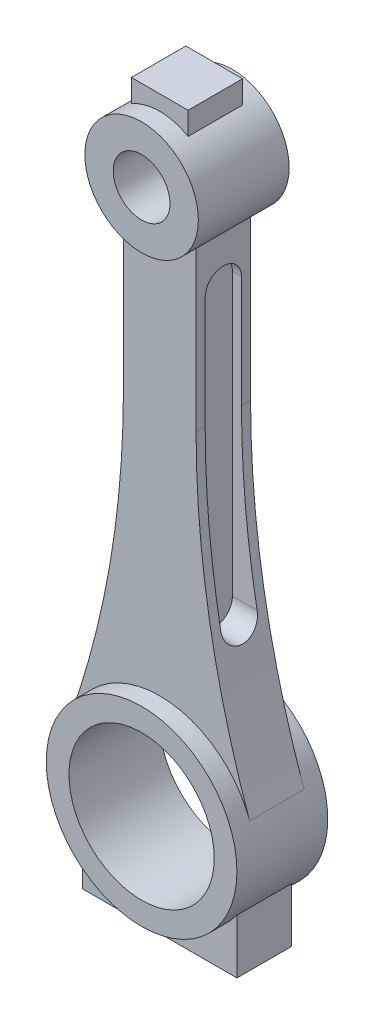
ISO-10303-21;
HEADER;
FILE_DESCRIPTION(('STEP AP214'),'2;1');
FILE_NAME('part.step','',(''),(''),'','','');
FILE_SCHEMA(('AUTOMOTIVE_DESIGN { 1 0 10303 214 1 1 1 1 }'));
ENDSEC;
DATA;
#1=APPLICATION_CONTEXT('core data for automotive mechanical design processes');
#2=APPLICATION_PROTOCOL_DEFINITION('international standard','automotive_design',2000,#1);
#3=PRODUCT_CONTEXT('',#1,'mechanical');
#4=PRODUCT('Part','Part','',(#3));
#5=PRODUCT_RELATED_PRODUCT_CATEGORY('part','',(#4));
#6=PRODUCT_DEFINITION_FORMATION('','',#4);
#7=PRODUCT_DEFINITION_CONTEXT('part definition',#1,'design');
#8=PRODUCT_DEFINITION('design','',#6,#7);
#9=PRODUCT_DEFINITION_SHAPE('','',#8);
#10=(LENGTH_UNIT() NAMED_UNIT(*) SI_UNIT(.MILLI.,.METRE.));
#11=(NAMED_UNIT(*) PLANE_ANGLE_UNIT() SI_UNIT($,.RADIAN.));
#12=(NAMED_UNIT(*) SI_UNIT($,.STERADIAN.) SOLID_ANGLE_UNIT());
#13=UNCERTAINTY_MEASURE_WITH_UNIT(LENGTH_MEASURE(1.E-05),#10,'distance_accuracy_value','');
#14=(GEOMETRIC_REPRESENTATION_CONTEXT(3) GLOBAL_UNCERTAINTY_ASSIGNED_CONTEXT((#13)) GLOBAL_UNIT_ASSIGNED_CONTEXT((#10,
#11,#12)) REPRESENTATION_CONTEXT('',''));
#15=CARTESIAN_POINT('',(0.,0.,0.));
#16=DIRECTION('',(0.,0.,1.));
#17=DIRECTION('',(1.,0.,0.));
#18=AXIS2_PLACEMENT_3D('',#15,#16,#17);
#19=CARTESIAN_POINT('',(212.132819979024,75.3953136438508,6.));
#20=DIRECTION('',(0.,0.,-1.));
#21=DIRECTION('',(-1.,0.,0.));
#22=AXIS2_PLACEMENT_3D('',#19,#20,#21);
#23=CYLINDRICAL_SURFACE('',#22,204.132819979024);
#24=CARTESIAN_POINT('',(11.4544735884215,38.,-4.00000000000001));
#25=CARTESIAN_POINT('',(11.4757515518411,37.8858086335559,-4.00000967356236));
#26=CARTESIAN_POINT('',(11.497127848932,37.7716411229782,-3.9951101211208));
#27=CARTESIAN_POINT('',(11.5399210356049,37.544152772884,-3.97557755361704));
#28=CARTESIAN_POINT('',(11.5613379239584,37.4308319082382,-3.9609448286138));
#29=CARTESIAN_POINT('',(11.6040518019029,37.2058589467753,-3.92203609087538));
#30=CARTESIAN_POINT('',(11.6253488219803,37.0942064124742,-3.89776265395078));
#31=CARTESIAN_POINT('',(11.6676599337569,36.8733657612217,-3.83975872762631));
#32=CARTESIAN_POINT('',(11.6886740293759,36.7641776101131,-3.80602836938937));
#33=CARTESIAN_POINT('',(11.7510730473326,36.4413470108117,-3.69089420326938));
#34=CARTESIAN_POINT('',(11.7918289081029,36.2323636826891,-3.59553432969808));
#35=CARTESIAN_POINT('',(11.8702126062764,35.833491871712,-3.37027556179514));
#36=CARTESIAN_POINT('',(11.9078413597511,35.643597793309,-3.24038682968163));
#37=CARTESIAN_POINT('',(11.9784728244352,35.2894796680367,-2.950436910244));
#38=CARTESIAN_POINT('',(12.0115036519544,35.1250988255321,-2.79057453802655));
#39=CARTESIAN_POINT('',(12.0720036427705,34.8256035029566,-2.44449926104124));
#40=CARTESIAN_POINT('',(12.0994724370193,34.6904909648341,-2.25828460915733));
#41=CARTESIAN_POINT('',(12.1473413477104,34.4559602912754,-1.86832249559897));
#42=CARTESIAN_POINT('',(12.1678582991115,34.3559510460777,-1.66494499104501));
#43=CARTESIAN_POINT('',(12.201667760202,34.1915558050773,-1.24372237948288));
#44=CARTESIAN_POINT('',(12.2149615713728,34.1271633917176,-1.02587988675161));
#45=CARTESIAN_POINT('',(12.2336033492388,34.0369591960168,-0.586274812122705));
#46=CARTESIAN_POINT('',(12.2390950212482,34.0104496060439,-0.364661335561855));
#47=CARTESIAN_POINT('',(12.2423732155319,33.9946184843632,0.0799443502249405));
#48=CARTESIAN_POINT('',(12.2401601145853,34.0052951341723,0.302936491499034));
#49=CARTESIAN_POINT('',(12.2281765408432,34.0632127244266,0.741781925824313));
#50=CARTESIAN_POINT('',(12.2184766498272,34.1101121767816,0.957682365575701));
#51=CARTESIAN_POINT('',(12.1919895794175,34.2385791029979,1.37844153266758));
#52=CARTESIAN_POINT('',(12.1752023313576,34.3201469127454,1.58330015300714));
#53=CARTESIAN_POINT('',(12.1350793834177,34.5159552856904,1.977397761575));
#54=CARTESIAN_POINT('',(12.1117098081663,34.6303649264094,2.16654921549123));
#55=CARTESIAN_POINT('',(12.0593260749273,34.8882465100265,2.52297125984128));
#56=CARTESIAN_POINT('',(12.0303117725959,35.0317191961119,2.69024129055299));
#57=CARTESIAN_POINT('',(11.9671383735568,35.3461665633751,3.00114206510914));
#58=CARTESIAN_POINT('',(11.9329025496515,35.5175545383741,3.14433904981939));
#59=CARTESIAN_POINT('',(11.8607975408037,35.8812712267655,3.40006280722765));
#60=CARTESIAN_POINT('',(11.8229268395298,36.0736086840292,3.51257670427656));
#61=CARTESIAN_POINT('',(11.744011046999,36.4777513253325,3.70593438635492));
#62=CARTESIAN_POINT('',(11.7029182624971,36.6898643551292,3.78611370956408));
#63=CARTESIAN_POINT('',(11.6195357198389,37.1241795414682,3.90944320644274));
#64=CARTESIAN_POINT('',(11.5772477716993,37.3463667203578,3.95264656840455));
#65=CARTESIAN_POINT('',(11.5215540274852,37.6417241762258,3.98457340087694));
#66=CARTESIAN_POINT('',(11.5080944382149,37.713314753212,3.99036111817269));
#67=CARTESIAN_POINT('',(11.4812368188341,37.8565916807733,3.99806924003837));
#68=CARTESIAN_POINT('',(11.467838723541,37.9282776734255,3.99999606757804));
#69=CARTESIAN_POINT('',(11.4544735884215,38.,4.));
#70=B_SPLINE_CURVE_WITH_KNOTS('',3,(#24,#25,#26,#27,#28,#29,#30,#31,#32,#33,#34,#35,#36,#37,#38,
#39,#40,#41,#42,#43,#44,#45,#46,#47,#48,#49,#50,#51,#52,#53,#54,#55,#56,#57,#58,#59,#60,#61,#62,
#63,#64,#65,#66,#67,#68,#69),.UNSPECIFIED.,.F.,.F.,(4,2,2,2,2,2,2,2,2,2,2,2,2,2,2,2,2,2,2,2,2,2,
4),(0.,0.348357600629778,0.696704820295753,1.044959030908,1.39320841164154,2.0894785742732,
2.78554404346983,3.47714614167072,4.1687941135383,4.84816302804556,5.52740949173436,
6.19397531687089,6.86050854603355,7.52083364695975,8.18116514562694,8.84495910470897,
9.50877004017901,10.1834922182609,10.8584970981523,11.546741507572,12.2339942357505,
12.4531452672714,12.6719314158043),.UNSPECIFIED.);
#71=CARTESIAN_POINT('',(11.4544735884215,38.,-4.00000000000001));
#72=VERTEX_POINT('',#71);
#73=CARTESIAN_POINT('',(11.4544735884215,38.,3.99999999999999));
#74=VERTEX_POINT('',#73);
#75=EDGE_CURVE('E423',#72,#74,#70,.T.);
#76=ORIENTED_EDGE('',*,*,#75,.T.);
#77=CARTESIAN_POINT('',(212.132819979024,75.3953136438508,4.));
#78=DIRECTION('',(0.,0.,-1.));
#79=DIRECTION('',(0.,1.,0.));
#80=AXIS2_PLACEMENT_3D('',#77,#78,#79);
#81=CIRCLE('',#80,204.132819979024);
#82=CARTESIAN_POINT('',(8.00000000000002,75.3953136438507,4.));
#83=VERTEX_POINT('',#82);
#84=EDGE_CURVE('E273',#74,#83,#81,.T.);
#85=ORIENTED_EDGE('',*,*,#84,.T.);
#86=DIRECTION('',(0.,0.,-1.));
#87=VECTOR('',#86,1.);
#88=CARTESIAN_POINT('',(8.00000000000002,75.3953136438507,6.));
#89=LINE('',#88,#87);
#90=CARTESIAN_POINT('',(8.00000000000002,75.3953136438507,6.));
#91=VERTEX_POINT('',#90);
#92=EDGE_CURVE('E400',#91,#83,#89,.T.);
#93=ORIENTED_EDGE('',*,*,#92,.F.);
#94=CARTESIAN_POINT('',(212.132819979024,75.3953136438508,6.));
#95=DIRECTION('',(0.,0.,1.));
#96=DIRECTION('',(1.,0.,0.));
#97=AXIS2_PLACEMENT_3D('',#94,#95,#96);
#98=CIRCLE('',#97,204.132819979024);
#99=CARTESIAN_POINT('',(19.7873824881444,7.03274443356763,6.));
#100=VERTEX_POINT('',#99);
#101=EDGE_CURVE('E353',#91,#100,#98,.T.);
#102=ORIENTED_EDGE('',*,*,#101,.T.);
#103=DIRECTION('',(0.,0.,-1.));
#104=VECTOR('',#103,1.);
#105=CARTESIAN_POINT('',(19.7873824881444,7.03274443356763,6.));
#106=LINE('',#105,#104);
#107=CARTESIAN_POINT('',(19.7873824881444,7.03274443356763,-6.));
#108=VERTEX_POINT('',#107);
#109=EDGE_CURVE('E369',#100,#108,#106,.T.);
#110=ORIENTED_EDGE('',*,*,#109,.T.);
#111=CARTESIAN_POINT('',(212.132819979024,75.3953136438508,-6.));
#112=DIRECTION('',(0.,0.,1.));
#113=DIRECTION('',(1.,0.,0.));
#114=AXIS2_PLACEMENT_3D('',#111,#112,#113);
#115=CIRCLE('',#114,204.132819979024);
#116=CARTESIAN_POINT('',(8.00000000000002,75.3953136438507,-6.));
#117=VERTEX_POINT('',#116);
#118=EDGE_CURVE('E350',#117,#108,#115,.T.);
#119=ORIENTED_EDGE('',*,*,#118,.F.);
#120=CARTESIAN_POINT('',(8.00000000000002,75.3953136438507,-4.));
#121=VERTEX_POINT('',#120);
#122=EDGE_CURVE('E399',#121,#117,#89,.T.);
#123=ORIENTED_EDGE('',*,*,#122,.F.);
#124=CARTESIAN_POINT('',(212.132819979024,75.3953136438508,-4.));
#125=DIRECTION('',(0.,0.,1.));
#126=DIRECTION('',(0.,-1.,0.));
#127=AXIS2_PLACEMENT_3D('',#124,#125,#126);
#128=CIRCLE('',#127,204.132819979024);
#129=EDGE_CURVE('E80',#121,#72,#128,.T.);
#130=ORIENTED_EDGE('',*,*,#129,.T.);
#131=EDGE_LOOP('',(#76,#85,#93,#102,#110,#119,#123,#130));
#132=FACE_BOUND('',#131,.T.);
#133=ADVANCED_FACE('F57',(#132),#23,.F.);
#134=CARTESIAN_POINT('',(8.00000000000002,0.,6.));
#135=DIRECTION('',(1.,0.,0.));
#136=DIRECTION('',(0.,1.,0.));
#137=AXIS2_PLACEMENT_3D('',#134,#135,#136);
#138=PLANE('',#137);
#139=ORIENTED_EDGE('',*,*,#92,.T.);
#140=DIRECTION('',(0.,1.,0.));
#141=VECTOR('',#140,1.);
#142=CARTESIAN_POINT('',(8.00000000000002,0.,3.99999999999999));
#143=LINE('',#142,#141);
#144=CARTESIAN_POINT('',(8.00000000000002,100.,4.));
#145=VERTEX_POINT('',#144);
#146=EDGE_CURVE('E420',#83,#145,#143,.T.);
#147=ORIENTED_EDGE('',*,*,#146,.T.);
#148=CARTESIAN_POINT('',(8.00000000000002,100.,0.));
#149=DIRECTION('',(1.,0.,0.));
#150=DIRECTION('',(0.,1.,0.));
#151=AXIS2_PLACEMENT_3D('',#148,#149,#150);
#152=CIRCLE('',#151,4.);
#153=CARTESIAN_POINT('',(8.00000000000002,100.,-4.));
#154=VERTEX_POINT('',#153);
#155=EDGE_CURVE('E417',#145,#154,#152,.F.);
#156=ORIENTED_EDGE('',*,*,#155,.T.);
#157=DIRECTION('',(0.,-1.,0.));
#158=VECTOR('',#157,1.);
#159=CARTESIAN_POINT('',(8.00000000000002,0.,-4.00000000000001));
#160=LINE('',#159,#158);
#161=EDGE_CURVE('E413',#154,#121,#160,.T.);
#162=ORIENTED_EDGE('',*,*,#161,.T.);
#163=ORIENTED_EDGE('',*,*,#122,.T.);
#164=DIRECTION('',(0.,-1.,0.));
#165=VECTOR('',#164,1.);
#166=CARTESIAN_POINT('',(8.00000000000002,0.,-6.));
#167=LINE('',#166,#165);
#168=CARTESIAN_POINT('',(8.00000000000002,110.395313643851,-6.));
#169=VERTEX_POINT('',#168);
#170=EDGE_CURVE('E372',#169,#117,#167,.T.);
#171=ORIENTED_EDGE('',*,*,#170,.F.);
#172=DIRECTION('',(0.,0.,-1.));
#173=VECTOR('',#172,1.);
#174=CARTESIAN_POINT('',(8.00000000000002,110.395313643851,6.));
#175=LINE('',#174,#173);
#176=CARTESIAN_POINT('',(8.00000000000002,110.395313643851,6.));
#177=VERTEX_POINT('',#176);
#178=EDGE_CURVE('E397',#177,#169,#175,.T.);
#179=ORIENTED_EDGE('',*,*,#178,.F.);
#180=DIRECTION('',(0.,-1.,0.));
#181=VECTOR('',#180,1.);
#182=CARTESIAN_POINT('',(8.00000000000002,0.,6.));
#183=LINE('',#182,#181);
#184=EDGE_CURVE('E356',#177,#91,#183,.T.);
#185=ORIENTED_EDGE('',*,*,#184,.T.);
#186=EDGE_LOOP('',(#139,#147,#156,#162,#163,#171,#179,#185));
#187=FACE_BOUND('',#186,.T.);
#188=ADVANCED_FACE('F548',(#187),#138,.T.);
#189=CARTESIAN_POINT('',(0.,120.,10.));
#190=DIRECTION('',(0.,0.,1.));
#191=DIRECTION('',(1.,0.,0.));
#192=AXIS2_PLACEMENT_3D('',#189,#190,#191);
#193=PLANE('',#192);
#194=CARTESIAN_POINT('',(0.,120.,10.));
#195=DIRECTION('',(0.,0.,1.));
#196=DIRECTION('',(1.,0.,0.));
#197=AXIS2_PLACEMENT_3D('',#194,#195,#196);
#198=CIRCLE('',#197,12.5);
#199=CARTESIAN_POINT('',(12.5,120.,10.));
#200=VERTEX_POINT('',#199);
#201=EDGE_CURVE('E410',#200,#200,#198,.T.);
#202=ORIENTED_EDGE('',*,*,#201,.T.);
#203=EDGE_LOOP('',(#202));
#204=FACE_BOUND('',#203,.T.);
#205=CARTESIAN_POINT('',(0.,120.,10.));
#206=DIRECTION('',(0.,0.,1.));
#207=DIRECTION('',(1.,0.,0.));
#208=AXIS2_PLACEMENT_3D('',#205,#206,#207);
#209=CIRCLE('',#208,6.25);
#210=CARTESIAN_POINT('',(6.25,120.,10.));
#211=VERTEX_POINT('',#210);
#212=EDGE_CURVE('E404',#211,#211,#209,.T.);
#213=ORIENTED_EDGE('',*,*,#212,.F.);
#214=EDGE_LOOP('',(#213));
#215=FACE_BOUND('',#214,.T.);
#216=ADVANCED_FACE('F553',(#204,#215),#193,.T.);
#217=CARTESIAN_POINT('',(0.,120.,-10.));
#218=DIRECTION('',(0.,0.,1.));
#219=DIRECTION('',(1.,0.,0.));
#220=AXIS2_PLACEMENT_3D('',#217,#218,#219);
#221=PLANE('',#220);
#222=CARTESIAN_POINT('',(0.,120.,-10.));
#223=DIRECTION('',(0.,0.,1.));
#224=DIRECTION('',(1.,0.,0.));
#225=AXIS2_PLACEMENT_3D('',#222,#223,#224);
#226=CIRCLE('',#225,12.5);
#227=CARTESIAN_POINT('',(12.5,120.,-10.));
#228=VERTEX_POINT('',#227);
#229=EDGE_CURVE('E407',#228,#228,#226,.T.);
#230=ORIENTED_EDGE('',*,*,#229,.F.);
#231=EDGE_LOOP('',(#230));
#232=FACE_BOUND('',#231,.T.);
#233=CARTESIAN_POINT('',(0.,120.,-10.));
#234=DIRECTION('',(0.,0.,1.));
#235=DIRECTION('',(1.,0.,0.));
#236=AXIS2_PLACEMENT_3D('',#233,#234,#235);
#237=CIRCLE('',#236,6.25);
#238=CARTESIAN_POINT('',(6.25,120.,-10.));
#239=VERTEX_POINT('',#238);
#240=EDGE_CURVE('E403',#239,#239,#237,.T.);
#241=ORIENTED_EDGE('',*,*,#240,.T.);
#242=EDGE_LOOP('',(#241));
#243=FACE_BOUND('',#242,.T.);
#244=ADVANCED_FACE('F739',(#232,#243),#221,.F.);
#245=CARTESIAN_POINT('',(0.,120.,10.));
#246=DIRECTION('',(0.,0.,-1.));
#247=DIRECTION('',(-1.,0.,0.));
#248=AXIS2_PLACEMENT_3D('',#245,#246,#247);
#249=CYLINDRICAL_SURFACE('',#248,12.5);
#250=DIRECTION('',(0.,0.,-1.));
#251=VECTOR('',#250,1.);
#252=CARTESIAN_POINT('',(6.25,130.825317547305,6.));
#253=LINE('',#252,#251);
#254=CARTESIAN_POINT('',(6.25,130.825317547305,6.));
#255=VERTEX_POINT('',#254);
#256=CARTESIAN_POINT('',(6.25,130.825317547305,-6.));
#257=VERTEX_POINT('',#256);
#258=EDGE_CURVE('E305',#255,#257,#253,.T.);
#259=ORIENTED_EDGE('',*,*,#258,.F.);
#260=CARTESIAN_POINT('',(0.,120.,6.));
#261=DIRECTION('',(0.,0.,1.));
#262=DIRECTION('',(1.,0.,0.));
#263=AXIS2_PLACEMENT_3D('',#260,#261,#262);
#264=CIRCLE('',#263,12.5);
#265=CARTESIAN_POINT('',(-6.25,130.825317547305,6.));
#266=VERTEX_POINT('',#265);
#267=EDGE_CURVE('E277',#255,#266,#264,.T.);
#268=ORIENTED_EDGE('',*,*,#267,.T.);
#269=DIRECTION('',(0.,0.,-1.));
#270=VECTOR('',#269,1.);
#271=CARTESIAN_POINT('',(-6.25,130.825317547305,6.));
#272=LINE('',#271,#270);
#273=CARTESIAN_POINT('',(-6.25,130.825317547305,-6.));
#274=VERTEX_POINT('',#273);
#275=EDGE_CURVE('E289',#266,#274,#272,.T.);
#276=ORIENTED_EDGE('',*,*,#275,.T.);
#277=CARTESIAN_POINT('',(0.,120.,-6.));
#278=DIRECTION('',(0.,0.,1.));
#279=DIRECTION('',(1.,0.,0.));
#280=AXIS2_PLACEMENT_3D('',#277,#278,#279);
#281=CIRCLE('',#280,12.5);
#282=EDGE_CURVE('E276',#257,#274,#281,.T.);
#283=ORIENTED_EDGE('',*,*,#282,.F.);
#284=EDGE_LOOP('',(#259,#268,#276,#283));
#285=FACE_BOUND('',#284,.T.);
#286=DIRECTION('',(0.,0.,-1.));
#287=VECTOR('',#286,1.);
#288=CARTESIAN_POINT('',(-8.00000000000002,110.395313643851,6.));
#289=LINE('',#288,#287);
#290=CARTESIAN_POINT('',(-8.00000000000002,110.395313643851,6.));
#291=VERTEX_POINT('',#290);
#292=CARTESIAN_POINT('',(-8.00000000000002,110.395313643851,-6.));
#293=VERTEX_POINT('',#292);
#294=EDGE_CURVE('E394',#291,#293,#289,.T.);
#295=ORIENTED_EDGE('',*,*,#294,.F.);
#296=CARTESIAN_POINT('',(0.,120.,6.));
#297=DIRECTION('',(0.,0.,1.));
#298=DIRECTION('',(1.,0.,0.));
#299=AXIS2_PLACEMENT_3D('',#296,#297,#298);
#300=CIRCLE('',#299,12.5);
#301=EDGE_CURVE('E360',#291,#177,#300,.T.);
#302=ORIENTED_EDGE('',*,*,#301,.T.);
#303=ORIENTED_EDGE('',*,*,#178,.T.);
#304=CARTESIAN_POINT('',(0.,120.,-6.));
#305=DIRECTION('',(0.,0.,1.));
#306=DIRECTION('',(1.,0.,0.));
#307=AXIS2_PLACEMENT_3D('',#304,#305,#306);
#308=CIRCLE('',#307,12.5);
#309=EDGE_CURVE('E375',#293,#169,#308,.T.);
#310=ORIENTED_EDGE('',*,*,#309,.F.);
#311=EDGE_LOOP('',(#295,#302,#303,#310));
#312=FACE_BOUND('',#311,.T.);
#313=ORIENTED_EDGE('',*,*,#201,.F.);
#314=EDGE_LOOP('',(#313));
#315=FACE_BOUND('',#314,.T.);
#316=ORIENTED_EDGE('',*,*,#229,.T.);
#317=EDGE_LOOP('',(#316));
#318=FACE_BOUND('',#317,.T.);
#319=ADVANCED_FACE('F59',(#285,#312,#315,#318),#249,.T.);
#320=CARTESIAN_POINT('',(0.,120.,10.));
#321=DIRECTION('',(0.,0.,-1.));
#322=DIRECTION('',(-1.,0.,0.));
#323=AXIS2_PLACEMENT_3D('',#320,#321,#322);
#324=CYLINDRICAL_SURFACE('',#323,6.25);
#325=ORIENTED_EDGE('',*,*,#212,.T.);
#326=EDGE_LOOP('',(#325));
#327=FACE_BOUND('',#326,.T.);
#328=ORIENTED_EDGE('',*,*,#240,.F.);
#329=EDGE_LOOP('',(#328));
#330=FACE_BOUND('',#329,.T.);
#331=ADVANCED_FACE('F644',(#327,#330),#324,.F.);
#332=CARTESIAN_POINT('',(-8.00000000000001,0.,6.));
#333=DIRECTION('',(1.,0.,0.));
#334=DIRECTION('',(0.,1.,0.));
#335=AXIS2_PLACEMENT_3D('',#332,#333,#334);
#336=PLANE('',#335);
#337=DIRECTION('',(0.,0.,-1.));
#338=VECTOR('',#337,1.);
#339=CARTESIAN_POINT('',(-8.00000000000001,75.3953136438507,6.));
#340=LINE('',#339,#338);
#341=CARTESIAN_POINT('',(-7.99999999999998,75.3953136438507,-4.));
#342=VERTEX_POINT('',#341);
#343=CARTESIAN_POINT('',(-8.00000000000001,75.3953136438507,-6.));
#344=VERTEX_POINT('',#343);
#345=EDGE_CURVE('E390',#342,#344,#340,.T.);
#346=ORIENTED_EDGE('',*,*,#345,.F.);
#347=DIRECTION('',(0.,1.,0.));
#348=VECTOR('',#347,1.);
#349=CARTESIAN_POINT('',(-8.00000000000001,0.,-4.00000000000001));
#350=LINE('',#349,#348);
#351=CARTESIAN_POINT('',(-8.00000000000002,100.,-4.));
#352=VERTEX_POINT('',#351);
#353=EDGE_CURVE('E249',#342,#352,#350,.T.);
#354=ORIENTED_EDGE('',*,*,#353,.T.);
#355=CARTESIAN_POINT('',(-8.00000000000002,100.,0.));
#356=DIRECTION('',(1.,0.,0.));
#357=DIRECTION('',(0.,1.,0.));
#358=AXIS2_PLACEMENT_3D('',#355,#356,#357);
#359=CIRCLE('',#358,4.);
#360=CARTESIAN_POINT('',(-8.00000000000002,100.,4.));
#361=VERTEX_POINT('',#360);
#362=EDGE_CURVE('E12',#352,#361,#359,.T.);
#363=ORIENTED_EDGE('',*,*,#362,.T.);
#364=DIRECTION('',(0.,-1.,0.));
#365=VECTOR('',#364,1.);
#366=CARTESIAN_POINT('',(-8.00000000000001,0.,3.99999999999999));
#367=LINE('',#366,#365);
#368=CARTESIAN_POINT('',(-7.99999999999998,75.3953136438507,4.));
#369=VERTEX_POINT('',#368);
#370=EDGE_CURVE('E222',#361,#369,#367,.T.);
#371=ORIENTED_EDGE('',*,*,#370,.T.);
#372=CARTESIAN_POINT('',(-8.00000000000001,75.3953136438507,6.));
#373=VERTEX_POINT('',#372);
#374=EDGE_CURVE('E391',#373,#369,#340,.T.);
#375=ORIENTED_EDGE('',*,*,#374,.F.);
#376=DIRECTION('',(0.,-1.,0.));
#377=VECTOR('',#376,1.);
#378=CARTESIAN_POINT('',(-8.00000000000001,0.,6.));
#379=LINE('',#378,#377);
#380=EDGE_CURVE('E362',#291,#373,#379,.T.);
#381=ORIENTED_EDGE('',*,*,#380,.F.);
#382=ORIENTED_EDGE('',*,*,#294,.T.);
#383=DIRECTION('',(0.,-1.,0.));
#384=VECTOR('',#383,1.);
#385=CARTESIAN_POINT('',(-8.00000000000001,0.,-6.));
#386=LINE('',#385,#384);
#387=EDGE_CURVE('E378',#293,#344,#386,.T.);
#388=ORIENTED_EDGE('',*,*,#387,.T.);
#389=EDGE_LOOP('',(#346,#354,#363,#371,#375,#381,#382,#388));
#390=FACE_BOUND('',#389,.T.);
#391=ADVANCED_FACE('F521',(#390),#336,.F.);
#392=CARTESIAN_POINT('',(-212.132819979024,75.3953136438507,6.));
#393=DIRECTION('',(0.,0.,-1.));
#394=DIRECTION('',(-1.,0.,0.));
#395=AXIS2_PLACEMENT_3D('',#392,#393,#394);
#396=CYLINDRICAL_SURFACE('',#395,204.132819979024);
#397=CARTESIAN_POINT('',(-11.4544735884215,38.,3.99999999999999));
#398=CARTESIAN_POINT('',(-11.4757515518411,37.8858086335559,4.00000967356234));
#399=CARTESIAN_POINT('',(-11.497127848932,37.7716411229782,3.99511012112078));
#400=CARTESIAN_POINT('',(-11.5399210356049,37.5441527728839,3.97557755361703));
#401=CARTESIAN_POINT('',(-11.5613379239584,37.4308319082382,3.96094482861378));
#402=CARTESIAN_POINT('',(-11.6040518019029,37.2058589467753,3.92203609087537));
#403=CARTESIAN_POINT('',(-11.6253488219803,37.0942064124742,3.89776265395076));
#404=CARTESIAN_POINT('',(-11.6676599337569,36.8733657612217,3.83975872762629));
#405=CARTESIAN_POINT('',(-11.688674029376,36.7641776101131,3.80602836938935));
#406=CARTESIAN_POINT('',(-11.7510730473326,36.4413470108117,3.69089420326937));
#407=CARTESIAN_POINT('',(-11.7918289081029,36.2323636826891,3.59553432969806));
#408=CARTESIAN_POINT('',(-11.8702126062764,35.833491871712,3.37027556179512));
#409=CARTESIAN_POINT('',(-11.9078413597511,35.643597793309,3.24038682968161));
#410=CARTESIAN_POINT('',(-11.9784728244352,35.2894796680367,2.95043691024397));
#411=CARTESIAN_POINT('',(-12.0115036519544,35.1250988255321,2.79057453802653));
#412=CARTESIAN_POINT('',(-12.0720036427705,34.8256035029566,2.44449926104122));
#413=CARTESIAN_POINT('',(-12.0994724370193,34.6904909648341,2.25828460915731));
#414=CARTESIAN_POINT('',(-12.1473413477104,34.4559602912754,1.86832249559895));
#415=CARTESIAN_POINT('',(-12.1678582991115,34.3559510460777,1.66494499104499));
#416=CARTESIAN_POINT('',(-12.201667760202,34.1915558050773,1.24372237948286));
#417=CARTESIAN_POINT('',(-12.2149615713728,34.1271633917176,1.02587988675159));
#418=CARTESIAN_POINT('',(-12.2336033492388,34.0369591960168,0.586274812122684));
#419=CARTESIAN_POINT('',(-12.2390950212482,34.0104496060439,0.364661335561834));
#420=CARTESIAN_POINT('',(-12.2423732155319,33.9946184843632,-0.0799443502249634));
#421=CARTESIAN_POINT('',(-12.2401601145853,34.0052951341723,-0.302936491499057));
#422=CARTESIAN_POINT('',(-12.2281765408432,34.0632127244266,-0.741781925824336));
#423=CARTESIAN_POINT('',(-12.2184766498272,34.1101121767816,-0.957682365575724));
#424=CARTESIAN_POINT('',(-12.1919895794175,34.2385791029979,-1.3784415326676));
#425=CARTESIAN_POINT('',(-12.1752023313576,34.3201469127454,-1.58330015300716));
#426=CARTESIAN_POINT('',(-12.1350793834177,34.5159552856904,-1.97739776157503));
#427=CARTESIAN_POINT('',(-12.1117098081663,34.6303649264094,-2.16654921549126));
#428=CARTESIAN_POINT('',(-12.0593260749273,34.8882465100265,-2.5229712598413));
#429=CARTESIAN_POINT('',(-12.0303117725959,35.0317191961119,-2.69024129055301));
#430=CARTESIAN_POINT('',(-11.9671383735568,35.3461665633751,-3.00114206510916));
#431=CARTESIAN_POINT('',(-11.9329025496515,35.5175545383741,-3.14433904981941));
#432=CARTESIAN_POINT('',(-11.8607975408037,35.8812712267655,-3.40006280722766));
#433=CARTESIAN_POINT('',(-11.8229268395298,36.0736086840292,-3.51257670427658));
#434=CARTESIAN_POINT('',(-11.744011046999,36.4777513253325,-3.70593438635493));
#435=CARTESIAN_POINT('',(-11.7029182624971,36.6898643551292,-3.7861137095641));
#436=CARTESIAN_POINT('',(-11.6195357198389,37.1241795414682,-3.90944320644276));
#437=CARTESIAN_POINT('',(-11.5772477716993,37.3463667203578,-3.95264656840456));
#438=CARTESIAN_POINT('',(-11.5215540274852,37.6417241762258,-3.98457340087696));
#439=CARTESIAN_POINT('',(-11.5080944382149,37.713314753212,-3.9903611181727));
#440=CARTESIAN_POINT('',(-11.4812368188341,37.8565916807734,-3.99806924003838));
#441=CARTESIAN_POINT('',(-11.467838723541,37.9282776734255,-3.99999606757806));
#442=CARTESIAN_POINT('',(-11.4544735884215,38.,-4.00000000000001));
#443=B_SPLINE_CURVE_WITH_KNOTS('',3,(#397,#398,#399,#400,#401,#402,#403,#404,#405,#406,#407,
#408,#409,#410,#411,#412,#413,#414,#415,#416,#417,#418,#419,#420,#421,#422,#423,#424,#425,#426,
#427,#428,#429,#430,#431,#432,#433,#434,#435,#436,#437,#438,#439,#440,#441,#442),.UNSPECIFIED.,
.F.,.F.,(4,2,2,2,2,2,2,2,2,2,2,2,2,2,2,2,2,2,2,2,2,2,4),(0.,0.348357600629775,0.696704820295757,
1.04495903090801,1.39320841164155,2.08947857427322,2.78554404346985,3.47714614167074,
4.16879411353831,4.84816302804556,5.52740949173436,6.1939753168709,6.86050854603356,
7.52083364695976,8.18116514562695,8.84495910470899,9.50877004017902,10.1834922182609,
10.8584970981523,11.546741507572,12.2339942357506,12.4531452672714,12.6719314158043),.UNSPECIFIED.);
#444=CARTESIAN_POINT('',(-11.4544735884215,38.,3.99999999999999));
#445=VERTEX_POINT('',#444);
#446=CARTESIAN_POINT('',(-11.4544735884215,38.,-4.00000000000001));
#447=VERTEX_POINT('',#446);
#448=EDGE_CURVE('E523',#445,#447,#443,.T.);
#449=ORIENTED_EDGE('',*,*,#448,.T.);
#450=CARTESIAN_POINT('',(-212.132819979024,75.3953136438507,-4.));
#451=DIRECTION('',(0.,0.,-1.));
#452=DIRECTION('',(0.,1.,0.));
#453=AXIS2_PLACEMENT_3D('',#450,#451,#452);
#454=CIRCLE('',#453,204.132819979024);
#455=EDGE_CURVE('E65',#447,#342,#454,.F.);
#456=ORIENTED_EDGE('',*,*,#455,.T.);
#457=ORIENTED_EDGE('',*,*,#345,.T.);
#458=CARTESIAN_POINT('',(-212.132819979024,75.3953136438507,-6.));
#459=DIRECTION('',(0.,0.,1.));
#460=DIRECTION('',(1.,0.,0.));
#461=AXIS2_PLACEMENT_3D('',#458,#459,#460);
#462=CIRCLE('',#461,204.132819979024);
#463=CARTESIAN_POINT('',(-19.7873824881444,7.03274443356763,-6.));
#464=VERTEX_POINT('',#463);
#465=EDGE_CURVE('E381',#344,#464,#462,.F.);
#466=ORIENTED_EDGE('',*,*,#465,.T.);
#467=DIRECTION('',(0.,0.,-1.));
#468=VECTOR('',#467,1.);
#469=CARTESIAN_POINT('',(-19.7873824881444,7.03274443356763,6.));
#470=LINE('',#469,#468);
#471=CARTESIAN_POINT('',(-19.7873824881444,7.03274443356763,6.));
#472=VERTEX_POINT('',#471);
#473=EDGE_CURVE('E388',#472,#464,#470,.T.);
#474=ORIENTED_EDGE('',*,*,#473,.F.);
#475=CARTESIAN_POINT('',(-212.132819979024,75.3953136438507,6.));
#476=DIRECTION('',(0.,0.,1.));
#477=DIRECTION('',(1.,0.,0.));
#478=AXIS2_PLACEMENT_3D('',#475,#476,#477);
#479=CIRCLE('',#478,204.132819979024);
#480=EDGE_CURVE('E364',#373,#472,#479,.F.);
#481=ORIENTED_EDGE('',*,*,#480,.F.);
#482=ORIENTED_EDGE('',*,*,#374,.T.);
#483=CARTESIAN_POINT('',(-212.132819979024,75.3953136438507,4.));
#484=DIRECTION('',(0.,0.,1.));
#485=DIRECTION('',(0.,-1.,0.));
#486=AXIS2_PLACEMENT_3D('',#483,#484,#485);
#487=CIRCLE('',#486,204.132819979024);
#488=EDGE_CURVE('E432',#369,#445,#487,.F.);
#489=ORIENTED_EDGE('',*,*,#488,.T.);
#490=EDGE_LOOP('',(#449,#456,#457,#466,#474,#481,#482,#489));
#491=FACE_BOUND('',#490,.T.);
#492=ADVANCED_FACE('F513',(#491),#396,.F.);
#493=CARTESIAN_POINT('',(0.,0.,6.));
#494=DIRECTION('',(0.,0.,1.));
#495=DIRECTION('',(1.,0.,0.));
#496=AXIS2_PLACEMENT_3D('',#493,#494,#495);
#497=PLANE('',#496);
#498=ORIENTED_EDGE('',*,*,#101,.F.);
#499=ORIENTED_EDGE('',*,*,#184,.F.);
#500=ORIENTED_EDGE('',*,*,#301,.F.);
#501=ORIENTED_EDGE('',*,*,#380,.T.);
#502=ORIENTED_EDGE('',*,*,#480,.T.);
#503=CARTESIAN_POINT('',(0.,0.,6.));
#504=DIRECTION('',(0.,0.,1.));
#505=DIRECTION('',(1.,0.,0.));
#506=AXIS2_PLACEMENT_3D('',#503,#504,#505);
#507=CIRCLE('',#506,21.);
#508=EDGE_CURVE('E367',#100,#472,#507,.T.);
#509=ORIENTED_EDGE('',*,*,#508,.F.);
#510=EDGE_LOOP('',(#498,#499,#500,#501,#502,#509));
#511=FACE_BOUND('',#510,.T.);
#512=ADVANCED_FACE('F510',(#511),#497,.T.);
#513=CARTESIAN_POINT('',(0.,0.,-6.));
#514=DIRECTION('',(0.,0.,1.));
#515=DIRECTION('',(1.,0.,0.));
#516=AXIS2_PLACEMENT_3D('',#513,#514,#515);
#517=PLANE('',#516);
#518=ORIENTED_EDGE('',*,*,#118,.T.);
#519=CARTESIAN_POINT('',(0.,0.,-6.));
#520=DIRECTION('',(0.,0.,1.));
#521=DIRECTION('',(1.,0.,0.));
#522=AXIS2_PLACEMENT_3D('',#519,#520,#521);
#523=CIRCLE('',#522,21.);
#524=EDGE_CURVE('E357',#108,#464,#523,.T.);
#525=ORIENTED_EDGE('',*,*,#524,.T.);
#526=ORIENTED_EDGE('',*,*,#465,.F.);
#527=ORIENTED_EDGE('',*,*,#387,.F.);
#528=ORIENTED_EDGE('',*,*,#309,.T.);
#529=ORIENTED_EDGE('',*,*,#170,.T.);
#530=EDGE_LOOP('',(#518,#525,#526,#527,#528,#529));
#531=FACE_BOUND('',#530,.T.);
#532=ADVANCED_FACE('F505',(#531),#517,.F.);
#533=CARTESIAN_POINT('',(0.,0.,10.));
#534=DIRECTION('',(0.,0.,1.));
#535=DIRECTION('',(1.,0.,0.));
#536=AXIS2_PLACEMENT_3D('',#533,#534,#535);
#537=PLANE('',#536);
#538=CARTESIAN_POINT('',(0.,0.,10.));
#539=DIRECTION('',(0.,0.,1.));
#540=DIRECTION('',(1.,0.,0.));
#541=AXIS2_PLACEMENT_3D('',#538,#539,#540);
#542=CIRCLE('',#541,21.);
#543=CARTESIAN_POINT('',(21.,0.,10.));
#544=VERTEX_POINT('',#543);
#545=EDGE_CURVE('E340',#544,#544,#542,.T.);
#546=ORIENTED_EDGE('',*,*,#545,.T.);
#547=EDGE_LOOP('',(#546));
#548=FACE_BOUND('',#547,.T.);
#549=CARTESIAN_POINT('',(0.,0.,10.));
#550=DIRECTION('',(0.,0.,1.));
#551=DIRECTION('',(1.,0.,0.));
#552=AXIS2_PLACEMENT_3D('',#549,#550,#551);
#553=CIRCLE('',#552,16.);
#554=CARTESIAN_POINT('',(16.,0.,10.));
#555=VERTEX_POINT('',#554);
#556=EDGE_CURVE('E344',#555,#555,#553,.T.);
#557=ORIENTED_EDGE('',*,*,#556,.F.);
#558=EDGE_LOOP('',(#557));
#559=FACE_BOUND('',#558,.T.);
#560=ADVANCED_FACE('F501',(#548,#559),#537,.T.);
#561=CARTESIAN_POINT('',(0.,0.,-10.));
#562=DIRECTION('',(0.,0.,1.));
#563=DIRECTION('',(1.,0.,0.));
#564=AXIS2_PLACEMENT_3D('',#561,#562,#563);
#565=PLANE('',#564);
#566=CARTESIAN_POINT('',(0.,0.,-10.));
#567=DIRECTION('',(0.,0.,1.));
#568=DIRECTION('',(1.,0.,0.));
#569=AXIS2_PLACEMENT_3D('',#566,#567,#568);
#570=CIRCLE('',#569,21.);
#571=CARTESIAN_POINT('',(21.,0.,-10.));
#572=VERTEX_POINT('',#571);
#573=EDGE_CURVE('E341',#572,#572,#570,.T.);
#574=ORIENTED_EDGE('',*,*,#573,.F.);
#575=EDGE_LOOP('',(#574));
#576=FACE_BOUND('',#575,.T.);
#577=CARTESIAN_POINT('',(0.,0.,-10.));
#578=DIRECTION('',(0.,0.,1.));
#579=DIRECTION('',(1.,0.,0.));
#580=AXIS2_PLACEMENT_3D('',#577,#578,#579);
#581=CIRCLE('',#580,16.);
#582=CARTESIAN_POINT('',(16.,0.,-10.));
#583=VERTEX_POINT('',#582);
#584=EDGE_CURVE('E347',#583,#583,#581,.T.);
#585=ORIENTED_EDGE('',*,*,#584,.T.);
#586=EDGE_LOOP('',(#585));
#587=FACE_BOUND('',#586,.T.);
#588=ADVANCED_FACE('F497',(#576,#587),#565,.F.);
#589=CARTESIAN_POINT('',(0.,0.,10.));
#590=DIRECTION('',(0.,0.,-1.));
#591=DIRECTION('',(-1.,0.,0.));
#592=AXIS2_PLACEMENT_3D('',#589,#590,#591);
#593=CYLINDRICAL_SURFACE('',#592,21.);
#594=DIRECTION('',(0.,0.,-1.));
#595=VECTOR('',#594,1.);
#596=CARTESIAN_POINT('',(-17.,-12.328828005938,6.));
#597=LINE('',#596,#595);
#598=CARTESIAN_POINT('',(-17.,-12.328828005938,6.));
#599=VERTEX_POINT('',#598);
#600=CARTESIAN_POINT('',(-17.,-12.328828005938,-6.));
#601=VERTEX_POINT('',#600);
#602=EDGE_CURVE('E337',#599,#601,#597,.T.);
#603=ORIENTED_EDGE('',*,*,#602,.F.);
#604=CARTESIAN_POINT('',(0.,0.,6.));
#605=DIRECTION('',(0.,0.,1.));
#606=DIRECTION('',(1.,0.,0.));
#607=AXIS2_PLACEMENT_3D('',#604,#605,#606);
#608=CIRCLE('',#607,21.);
#609=CARTESIAN_POINT('',(17.,-12.328828005938,6.));
#610=VERTEX_POINT('',#609);
#611=EDGE_CURVE('E309',#599,#610,#608,.T.);
#612=ORIENTED_EDGE('',*,*,#611,.T.);
#613=DIRECTION('',(0.,0.,-1.));
#614=VECTOR('',#613,1.);
#615=CARTESIAN_POINT('',(17.,-12.328828005938,6.));
#616=LINE('',#615,#614);
#617=CARTESIAN_POINT('',(17.,-12.328828005938,-6.));
#618=VERTEX_POINT('',#617);
#619=EDGE_CURVE('E321',#610,#618,#616,.T.);
#620=ORIENTED_EDGE('',*,*,#619,.T.);
#621=CARTESIAN_POINT('',(0.,0.,-6.));
#622=DIRECTION('',(0.,0.,1.));
#623=DIRECTION('',(1.,0.,0.));
#624=AXIS2_PLACEMENT_3D('',#621,#622,#623);
#625=CIRCLE('',#624,21.);
#626=EDGE_CURVE('E308',#601,#618,#625,.T.);
#627=ORIENTED_EDGE('',*,*,#626,.F.);
#628=EDGE_LOOP('',(#603,#612,#620,#627));
#629=FACE_BOUND('',#628,.T.);
#630=ORIENTED_EDGE('',*,*,#508,.T.);
#631=ORIENTED_EDGE('',*,*,#473,.T.);
#632=ORIENTED_EDGE('',*,*,#524,.F.);
#633=ORIENTED_EDGE('',*,*,#109,.F.);
#634=EDGE_LOOP('',(#630,#631,#632,#633));
#635=FACE_BOUND('',#634,.T.);
#636=ORIENTED_EDGE('',*,*,#545,.F.);
#637=EDGE_LOOP('',(#636));
#638=FACE_BOUND('',#637,.T.);
#639=ORIENTED_EDGE('',*,*,#573,.T.);
#640=EDGE_LOOP('',(#639));
#641=FACE_BOUND('',#640,.T.);
#642=ADVANCED_FACE('F494',(#629,#635,#638,#641),#593,.T.);
#643=CARTESIAN_POINT('',(0.,0.,10.));
#644=DIRECTION('',(0.,0.,-1.));
#645=DIRECTION('',(-1.,0.,0.));
#646=AXIS2_PLACEMENT_3D('',#643,#644,#645);
#647=CYLINDRICAL_SURFACE('',#646,16.);
#648=ORIENTED_EDGE('',*,*,#556,.T.);
#649=EDGE_LOOP('',(#648));
#650=FACE_BOUND('',#649,.T.);
#651=ORIENTED_EDGE('',*,*,#584,.F.);
#652=EDGE_LOOP('',(#651));
#653=FACE_BOUND('',#652,.T.);
#654=ADVANCED_FACE('F492',(#650,#653),#647,.F.);
#655=CARTESIAN_POINT('',(-17.,0.,6.));
#656=DIRECTION('',(-1.,0.,0.));
#657=DIRECTION('',(0.,0.,1.));
#658=AXIS2_PLACEMENT_3D('',#655,#656,#657);
#659=PLANE('',#658);
#660=DIRECTION('',(0.,1.,0.));
#661=VECTOR('',#660,1.);
#662=CARTESIAN_POINT('',(-17.,0.,-6.));
#663=LINE('',#662,#661);
#664=CARTESIAN_POINT('',(-17.,-24.328828005938,-6.));
#665=VERTEX_POINT('',#664);
#666=EDGE_CURVE('E324',#665,#601,#663,.T.);
#667=ORIENTED_EDGE('',*,*,#666,.F.);
#668=DIRECTION('',(0.,0.,-1.));
#669=VECTOR('',#668,1.);
#670=CARTESIAN_POINT('',(-17.,-24.328828005938,6.));
#671=LINE('',#670,#669);
#672=CARTESIAN_POINT('',(-17.,-24.328828005938,6.));
#673=VERTEX_POINT('',#672);
#674=EDGE_CURVE('E335',#673,#665,#671,.T.);
#675=ORIENTED_EDGE('',*,*,#674,.F.);
#676=DIRECTION('',(0.,1.,0.));
#677=VECTOR('',#676,1.);
#678=CARTESIAN_POINT('',(-17.,0.,6.));
#679=LINE('',#678,#677);
#680=EDGE_CURVE('E311',#673,#599,#679,.T.);
#681=ORIENTED_EDGE('',*,*,#680,.T.);
#682=ORIENTED_EDGE('',*,*,#602,.T.);
#683=EDGE_LOOP('',(#667,#675,#681,#682));
#684=FACE_BOUND('',#683,.T.);
#685=ADVANCED_FACE('F488',(#684),#659,.T.);
#686=CARTESIAN_POINT('',(0.,-24.328828005938,6.));
#687=DIRECTION('',(0.,-1.,0.));
#688=DIRECTION('',(0.,0.,-1.));
#689=AXIS2_PLACEMENT_3D('',#686,#687,#688);
#690=PLANE('',#689);
#691=DIRECTION('',(-1.,0.,0.));
#692=VECTOR('',#691,1.);
#693=CARTESIAN_POINT('',(0.,-24.328828005938,-6.));
#694=LINE('',#693,#692);
#695=CARTESIAN_POINT('',(17.,-24.328828005938,-6.));
#696=VERTEX_POINT('',#695);
#697=EDGE_CURVE('E327',#696,#665,#694,.T.);
#698=ORIENTED_EDGE('',*,*,#697,.F.);
#699=DIRECTION('',(0.,0.,-1.));
#700=VECTOR('',#699,1.);
#701=CARTESIAN_POINT('',(17.,-24.328828005938,6.));
#702=LINE('',#701,#700);
#703=CARTESIAN_POINT('',(17.,-24.328828005938,6.));
#704=VERTEX_POINT('',#703);
#705=EDGE_CURVE('E333',#704,#696,#702,.T.);
#706=ORIENTED_EDGE('',*,*,#705,.F.);
#707=DIRECTION('',(-1.,0.,0.));
#708=VECTOR('',#707,1.);
#709=CARTESIAN_POINT('',(0.,-24.328828005938,6.));
#710=LINE('',#709,#708);
#711=EDGE_CURVE('E315',#704,#673,#710,.T.);
#712=ORIENTED_EDGE('',*,*,#711,.T.);
#713=ORIENTED_EDGE('',*,*,#674,.T.);
#714=EDGE_LOOP('',(#698,#706,#712,#713));
#715=FACE_BOUND('',#714,.T.);
#716=ADVANCED_FACE('F484',(#715),#690,.T.);
#717=CARTESIAN_POINT('',(17.,0.,6.));
#718=DIRECTION('',(1.,0.,0.));
#719=DIRECTION('',(0.,1.,0.));
#720=AXIS2_PLACEMENT_3D('',#717,#718,#719);
#721=PLANE('',#720);
#722=DIRECTION('',(0.,-1.,0.));
#723=VECTOR('',#722,1.);
#724=CARTESIAN_POINT('',(17.,0.,-6.));
#725=LINE('',#724,#723);
#726=EDGE_CURVE('E312',#618,#696,#725,.T.);
#727=ORIENTED_EDGE('',*,*,#726,.F.);
#728=ORIENTED_EDGE('',*,*,#619,.F.);
#729=DIRECTION('',(0.,-1.,0.));
#730=VECTOR('',#729,1.);
#731=CARTESIAN_POINT('',(17.,0.,6.));
#732=LINE('',#731,#730);
#733=EDGE_CURVE('E318',#610,#704,#732,.T.);
#734=ORIENTED_EDGE('',*,*,#733,.T.);
#735=ORIENTED_EDGE('',*,*,#705,.T.);
#736=EDGE_LOOP('',(#727,#728,#734,#735));
#737=FACE_BOUND('',#736,.T.);
#738=ADVANCED_FACE('F477',(#737),#721,.T.);
#739=CARTESIAN_POINT('',(0.,0.,6.));
#740=DIRECTION('',(0.,0.,1.));
#741=DIRECTION('',(1.,0.,0.));
#742=AXIS2_PLACEMENT_3D('',#739,#740,#741);
#743=PLANE('',#742);
#744=ORIENTED_EDGE('',*,*,#611,.F.);
#745=ORIENTED_EDGE('',*,*,#680,.F.);
#746=ORIENTED_EDGE('',*,*,#711,.F.);
#747=ORIENTED_EDGE('',*,*,#733,.F.);
#748=EDGE_LOOP('',(#744,#745,#746,#747));
#749=FACE_BOUND('',#748,.T.);
#750=ADVANCED_FACE('F474',(#749),#743,.T.);
#751=CARTESIAN_POINT('',(0.,0.,-6.));
#752=DIRECTION('',(0.,0.,1.));
#753=DIRECTION('',(1.,0.,0.));
#754=AXIS2_PLACEMENT_3D('',#751,#752,#753);
#755=PLANE('',#754);
#756=ORIENTED_EDGE('',*,*,#626,.T.);
#757=ORIENTED_EDGE('',*,*,#726,.T.);
#758=ORIENTED_EDGE('',*,*,#697,.T.);
#759=ORIENTED_EDGE('',*,*,#666,.T.);
#760=EDGE_LOOP('',(#756,#757,#758,#759));
#761=FACE_BOUND('',#760,.T.);
#762=ADVANCED_FACE('F472',(#761),#755,.F.);
#763=CARTESIAN_POINT('',(6.25000000000002,0.,6.));
#764=DIRECTION('',(1.,0.,0.));
#765=DIRECTION('',(0.,1.,0.));
#766=AXIS2_PLACEMENT_3D('',#763,#764,#765);
#767=PLANE('',#766);
#768=DIRECTION('',(0.,-1.,0.));
#769=VECTOR('',#768,1.);
#770=CARTESIAN_POINT('',(6.25000000000002,0.,-6.));
#771=LINE('',#770,#769);
#772=CARTESIAN_POINT('',(6.25,135.825317547305,-6.));
#773=VERTEX_POINT('',#772);
#774=EDGE_CURVE('E292',#773,#257,#771,.T.);
#775=ORIENTED_EDGE('',*,*,#774,.F.);
#776=DIRECTION('',(0.,0.,-1.));
#777=VECTOR('',#776,1.);
#778=CARTESIAN_POINT('',(6.25,135.825317547305,6.));
#779=LINE('',#778,#777);
#780=CARTESIAN_POINT('',(6.25,135.825317547305,6.));
#781=VERTEX_POINT('',#780);
#782=EDGE_CURVE('E303',#781,#773,#779,.T.);
#783=ORIENTED_EDGE('',*,*,#782,.F.);
#784=DIRECTION('',(0.,-1.,0.));
#785=VECTOR('',#784,1.);
#786=CARTESIAN_POINT('',(6.25000000000002,0.,6.));
#787=LINE('',#786,#785);
#788=EDGE_CURVE('E279',#781,#255,#787,.T.);
#789=ORIENTED_EDGE('',*,*,#788,.T.);
#790=ORIENTED_EDGE('',*,*,#258,.T.);
#791=EDGE_LOOP('',(#775,#783,#789,#790));
#792=FACE_BOUND('',#791,.T.);
#793=ADVANCED_FACE('F468',(#792),#767,.T.);
#794=CARTESIAN_POINT('',(0.,135.825317547305,6.));
#795=DIRECTION('',(0.,1.,0.));
#796=DIRECTION('',(0.,0.,1.));
#797=AXIS2_PLACEMENT_3D('',#794,#795,#796);
#798=PLANE('',#797);
#799=DIRECTION('',(1.,0.,0.));
#800=VECTOR('',#799,1.);
#801=CARTESIAN_POINT('',(0.,135.825317547305,-6.));
#802=LINE('',#801,#800);
#803=CARTESIAN_POINT('',(-6.25,135.825317547305,-6.));
#804=VERTEX_POINT('',#803);
#805=EDGE_CURVE('E295',#804,#773,#802,.T.);
#806=ORIENTED_EDGE('',*,*,#805,.F.);
#807=DIRECTION('',(0.,0.,-1.));
#808=VECTOR('',#807,1.);
#809=CARTESIAN_POINT('',(-6.25,135.825317547305,6.));
#810=LINE('',#809,#808);
#811=CARTESIAN_POINT('',(-6.25,135.825317547305,6.));
#812=VERTEX_POINT('',#811);
#813=EDGE_CURVE('E301',#812,#804,#810,.T.);
#814=ORIENTED_EDGE('',*,*,#813,.F.);
#815=DIRECTION('',(1.,0.,0.));
#816=VECTOR('',#815,1.);
#817=CARTESIAN_POINT('',(0.,135.825317547305,6.));
#818=LINE('',#817,#816);
#819=EDGE_CURVE('E283',#812,#781,#818,.T.);
#820=ORIENTED_EDGE('',*,*,#819,.T.);
#821=ORIENTED_EDGE('',*,*,#782,.T.);
#822=EDGE_LOOP('',(#806,#814,#820,#821));
#823=FACE_BOUND('',#822,.T.);
#824=ADVANCED_FACE('F464',(#823),#798,.T.);
#825=CARTESIAN_POINT('',(-6.24999999999998,0.,6.));
#826=DIRECTION('',(-1.,0.,0.));
#827=DIRECTION('',(0.,-1.,0.));
#828=AXIS2_PLACEMENT_3D('',#825,#826,#827);
#829=PLANE('',#828);
#830=DIRECTION('',(0.,1.,0.));
#831=VECTOR('',#830,1.);
#832=CARTESIAN_POINT('',(-6.24999999999998,0.,-6.));
#833=LINE('',#832,#831);
#834=EDGE_CURVE('E280',#274,#804,#833,.T.);
#835=ORIENTED_EDGE('',*,*,#834,.F.);
#836=ORIENTED_EDGE('',*,*,#275,.F.);
#837=DIRECTION('',(0.,1.,0.));
#838=VECTOR('',#837,1.);
#839=CARTESIAN_POINT('',(-6.24999999999998,0.,6.));
#840=LINE('',#839,#838);
#841=EDGE_CURVE('E286',#266,#812,#840,.T.);
#842=ORIENTED_EDGE('',*,*,#841,.T.);
#843=ORIENTED_EDGE('',*,*,#813,.T.);
#844=EDGE_LOOP('',(#835,#836,#842,#843));
#845=FACE_BOUND('',#844,.T.);
#846=ADVANCED_FACE('F457',(#845),#829,.T.);
#847=CARTESIAN_POINT('',(0.,0.,6.));
#848=DIRECTION('',(0.,0.,1.));
#849=DIRECTION('',(1.,0.,0.));
#850=AXIS2_PLACEMENT_3D('',#847,#848,#849);
#851=PLANE('',#850);
#852=ORIENTED_EDGE('',*,*,#267,.F.);
#853=ORIENTED_EDGE('',*,*,#788,.F.);
#854=ORIENTED_EDGE('',*,*,#819,.F.);
#855=ORIENTED_EDGE('',*,*,#841,.F.);
#856=EDGE_LOOP('',(#852,#853,#854,#855));
#857=FACE_BOUND('',#856,.T.);
#858=ADVANCED_FACE('F454',(#857),#851,.T.);
#859=CARTESIAN_POINT('',(0.,0.,-6.));
#860=DIRECTION('',(0.,0.,1.));
#861=DIRECTION('',(1.,0.,0.));
#862=AXIS2_PLACEMENT_3D('',#859,#860,#861);
#863=PLANE('',#862);
#864=ORIENTED_EDGE('',*,*,#282,.T.);
#865=ORIENTED_EDGE('',*,*,#834,.T.);
#866=ORIENTED_EDGE('',*,*,#805,.T.);
#867=ORIENTED_EDGE('',*,*,#774,.T.);
#868=EDGE_LOOP('',(#864,#865,#866,#867));
#869=FACE_BOUND('',#868,.T.);
#870=ADVANCED_FACE('F452',(#869),#863,.F.);
#871=CARTESIAN_POINT('',(21.,100.,0.));
#872=DIRECTION('',(-1.,0.,0.));
#873=DIRECTION('',(0.,0.,1.));
#874=AXIS2_PLACEMENT_3D('',#871,#872,#873);
#875=CYLINDRICAL_SURFACE('',#874,4.);
#876=DIRECTION('',(-1.,0.,0.));
#877=VECTOR('',#876,1.);
#878=CARTESIAN_POINT('',(21.,100.,4.));
#879=LINE('',#878,#877);
#880=CARTESIAN_POINT('',(6.,100.,4.));
#881=VERTEX_POINT('',#880);
#882=EDGE_CURVE('E270',#145,#881,#879,.T.);
#883=ORIENTED_EDGE('',*,*,#882,.T.);
#884=CARTESIAN_POINT('',(6.,100.,0.));
#885=DIRECTION('',(1.,0.,0.));
#886=DIRECTION('',(0.,0.,-1.));
#887=AXIS2_PLACEMENT_3D('',#884,#885,#886);
#888=CIRCLE('',#887,4.);
#889=CARTESIAN_POINT('',(6.,100.,-4.));
#890=VERTEX_POINT('',#889);
#891=EDGE_CURVE('E252',#890,#881,#888,.T.);
#892=ORIENTED_EDGE('',*,*,#891,.F.);
#893=DIRECTION('',(-1.,0.,0.));
#894=VECTOR('',#893,1.);
#895=CARTESIAN_POINT('',(21.,100.,-4.));
#896=LINE('',#895,#894);
#897=EDGE_CURVE('E264',#154,#890,#896,.T.);
#898=ORIENTED_EDGE('',*,*,#897,.F.);
#899=ORIENTED_EDGE('',*,*,#155,.F.);
#900=EDGE_LOOP('',(#883,#892,#898,#899));
#901=FACE_BOUND('',#900,.T.);
#902=ADVANCED_FACE('F448',(#901),#875,.F.);
#903=CARTESIAN_POINT('',(21.,100.,4.));
#904=DIRECTION('',(0.,0.,-1.));
#905=DIRECTION('',(0.,1.,0.));
#906=AXIS2_PLACEMENT_3D('',#903,#904,#905);
#907=PLANE('',#906);
#908=DIRECTION('',(-1.,0.,0.));
#909=VECTOR('',#908,1.);
#910=CARTESIAN_POINT('',(21.,38.,3.99999999999999));
#911=LINE('',#910,#909);
#912=CARTESIAN_POINT('',(6.,38.,3.99999999999999));
#913=VERTEX_POINT('',#912);
#914=EDGE_CURVE('E268',#74,#913,#911,.T.);
#915=ORIENTED_EDGE('',*,*,#914,.T.);
#916=DIRECTION('',(0.,-1.,0.));
#917=VECTOR('',#916,1.);
#918=CARTESIAN_POINT('',(6.,100.,4.));
#919=LINE('',#918,#917);
#920=EDGE_CURVE('E255',#881,#913,#919,.T.);
#921=ORIENTED_EDGE('',*,*,#920,.F.);
#922=ORIENTED_EDGE('',*,*,#882,.F.);
#923=ORIENTED_EDGE('',*,*,#146,.F.);
#924=ORIENTED_EDGE('',*,*,#84,.F.);
#925=EDGE_LOOP('',(#915,#921,#922,#923,#924));
#926=FACE_BOUND('',#925,.T.);
#927=ADVANCED_FACE('F443',(#926),#907,.T.);
#928=CARTESIAN_POINT('',(21.,38.,0.));
#929=DIRECTION('',(-1.,0.,0.));
#930=DIRECTION('',(0.,0.,1.));
#931=AXIS2_PLACEMENT_3D('',#928,#929,#930);
#932=CYLINDRICAL_SURFACE('',#931,4.);
#933=DIRECTION('',(-1.,0.,0.));
#934=VECTOR('',#933,1.);
#935=CARTESIAN_POINT('',(21.,38.,-4.00000000000001));
#936=LINE('',#935,#934);
#937=CARTESIAN_POINT('',(6.,38.,-4.00000000000001));
#938=VERTEX_POINT('',#937);
#939=EDGE_CURVE('E266',#72,#938,#936,.T.);
#940=ORIENTED_EDGE('',*,*,#939,.T.);
#941=CARTESIAN_POINT('',(6.,38.,0.));
#942=DIRECTION('',(1.,0.,0.));
#943=DIRECTION('',(0.,0.,-1.));
#944=AXIS2_PLACEMENT_3D('',#941,#942,#943);
#945=CIRCLE('',#944,4.);
#946=EDGE_CURVE('E258',#913,#938,#945,.T.);
#947=ORIENTED_EDGE('',*,*,#946,.F.);
#948=ORIENTED_EDGE('',*,*,#914,.F.);
#949=ORIENTED_EDGE('',*,*,#75,.F.);
#950=EDGE_LOOP('',(#940,#947,#948,#949));
#951=FACE_BOUND('',#950,.T.);
#952=ADVANCED_FACE('F437',(#951),#932,.F.);
#953=CARTESIAN_POINT('',(21.,100.,-4.));
#954=DIRECTION('',(0.,0.,1.));
#955=DIRECTION('',(0.,-1.,0.));
#956=AXIS2_PLACEMENT_3D('',#953,#954,#955);
#957=PLANE('',#956);
#958=ORIENTED_EDGE('',*,*,#161,.F.);
#959=ORIENTED_EDGE('',*,*,#897,.T.);
#960=DIRECTION('',(0.,1.,0.));
#961=VECTOR('',#960,1.);
#962=CARTESIAN_POINT('',(6.,100.,-4.));
#963=LINE('',#962,#961);
#964=EDGE_CURVE('E261',#938,#890,#963,.T.);
#965=ORIENTED_EDGE('',*,*,#964,.F.);
#966=ORIENTED_EDGE('',*,*,#939,.F.);
#967=ORIENTED_EDGE('',*,*,#129,.F.);
#968=EDGE_LOOP('',(#958,#959,#965,#966,#967));
#969=FACE_BOUND('',#968,.T.);
#970=ADVANCED_FACE('F442',(#969),#957,.T.);
#971=CARTESIAN_POINT('',(6.,100.,0.));
#972=DIRECTION('',(1.,0.,0.));
#973=DIRECTION('',(0.,0.,-1.));
#974=AXIS2_PLACEMENT_3D('',#971,#972,#973);
#975=PLANE('',#974);
#976=ORIENTED_EDGE('',*,*,#891,.T.);
#977=ORIENTED_EDGE('',*,*,#920,.T.);
#978=ORIENTED_EDGE('',*,*,#946,.T.);
#979=ORIENTED_EDGE('',*,*,#964,.T.);
#980=EDGE_LOOP('',(#976,#977,#978,#979));
#981=FACE_BOUND('',#980,.T.);
#982=ADVANCED_FACE('F541',(#981),#975,.T.);
#983=CARTESIAN_POINT('',(-21.,100.,0.));
#984=DIRECTION('',(1.,0.,0.));
#985=DIRECTION('',(0.,0.,-1.));
#986=AXIS2_PLACEMENT_3D('',#983,#984,#985);
#987=CYLINDRICAL_SURFACE('',#986,4.);
#988=DIRECTION('',(1.,0.,0.));
#989=VECTOR('',#988,1.);
#990=CARTESIAN_POINT('',(-21.,100.,-4.));
#991=LINE('',#990,#989);
#992=CARTESIAN_POINT('',(-6.,100.,-4.));
#993=VERTEX_POINT('',#992);
#994=EDGE_CURVE('E239',#352,#993,#991,.T.);
#995=ORIENTED_EDGE('',*,*,#994,.T.);
#996=CARTESIAN_POINT('',(-6.,100.,0.));
#997=DIRECTION('',(1.,0.,0.));
#998=DIRECTION('',(0.,0.,-1.));
#999=AXIS2_PLACEMENT_3D('',#996,#997,#998);
#1000=CIRCLE('',#999,4.);
#1001=CARTESIAN_POINT('',(-6.,100.,4.));
#1002=VERTEX_POINT('',#1001);
#1003=EDGE_CURVE('E232',#993,#1002,#1000,.T.);
#1004=ORIENTED_EDGE('',*,*,#1003,.T.);
#1005=DIRECTION('',(1.,0.,0.));
#1006=VECTOR('',#1005,1.);
#1007=CARTESIAN_POINT('',(-21.,100.,4.));
#1008=LINE('',#1007,#1006);
#1009=EDGE_CURVE('E217',#361,#1002,#1008,.T.);
#1010=ORIENTED_EDGE('',*,*,#1009,.F.);
#1011=ORIENTED_EDGE('',*,*,#362,.F.);
#1012=EDGE_LOOP('',(#995,#1004,#1010,#1011));
#1013=FACE_BOUND('',#1012,.T.);
#1014=ADVANCED_FACE('F237',(#1013),#987,.F.);
#1015=CARTESIAN_POINT('',(-21.,100.,-4.));
#1016=DIRECTION('',(0.,0.,-1.));
#1017=DIRECTION('',(0.,1.,0.));
#1018=AXIS2_PLACEMENT_3D('',#1015,#1016,#1017);
#1019=PLANE('',#1018);
#1020=ORIENTED_EDGE('',*,*,#455,.F.);
#1021=DIRECTION('',(1.,0.,0.));
#1022=VECTOR('',#1021,1.);
#1023=CARTESIAN_POINT('',(-21.,38.,-4.00000000000001));
#1024=LINE('',#1023,#1022);
#1025=CARTESIAN_POINT('',(-6.,38.,-4.00000000000001));
#1026=VERTEX_POINT('',#1025);
#1027=EDGE_CURVE('E245',#447,#1026,#1024,.T.);
#1028=ORIENTED_EDGE('',*,*,#1027,.T.);
#1029=DIRECTION('',(0.,1.,0.));
#1030=VECTOR('',#1029,1.);
#1031=CARTESIAN_POINT('',(-6.,100.,-4.));
#1032=LINE('',#1031,#1030);
#1033=EDGE_CURVE('E225',#1026,#993,#1032,.T.);
#1034=ORIENTED_EDGE('',*,*,#1033,.T.);
#1035=ORIENTED_EDGE('',*,*,#994,.F.);
#1036=ORIENTED_EDGE('',*,*,#353,.F.);
#1037=EDGE_LOOP('',(#1020,#1028,#1034,#1035,#1036));
#1038=FACE_BOUND('',#1037,.T.);
#1039=ADVANCED_FACE('F535',(#1038),#1019,.F.);
#1040=CARTESIAN_POINT('',(-21.,38.,0.));
#1041=DIRECTION('',(1.,0.,0.));
#1042=DIRECTION('',(0.,0.,-1.));
#1043=AXIS2_PLACEMENT_3D('',#1040,#1041,#1042);
#1044=CYLINDRICAL_SURFACE('',#1043,4.);
#1045=DIRECTION('',(1.,0.,0.));
#1046=VECTOR('',#1045,1.);
#1047=CARTESIAN_POINT('',(-21.,38.,3.99999999999999));
#1048=LINE('',#1047,#1046);
#1049=CARTESIAN_POINT('',(-6.,38.,3.99999999999999));
#1050=VERTEX_POINT('',#1049);
#1051=EDGE_CURVE('E72',#445,#1050,#1048,.T.);
#1052=ORIENTED_EDGE('',*,*,#1051,.T.);
#1053=CARTESIAN_POINT('',(-6.,38.,0.));
#1054=DIRECTION('',(1.,0.,0.));
#1055=DIRECTION('',(0.,0.,-1.));
#1056=AXIS2_PLACEMENT_3D('',#1053,#1054,#1055);
#1057=CIRCLE('',#1056,4.);
#1058=EDGE_CURVE('E235',#1050,#1026,#1057,.T.);
#1059=ORIENTED_EDGE('',*,*,#1058,.T.);
#1060=ORIENTED_EDGE('',*,*,#1027,.F.);
#1061=ORIENTED_EDGE('',*,*,#448,.F.);
#1062=EDGE_LOOP('',(#1052,#1059,#1060,#1061));
#1063=FACE_BOUND('',#1062,.T.);
#1064=ADVANCED_FACE('F530',(#1063),#1044,.F.);
#1065=CARTESIAN_POINT('',(-21.,100.,4.));
#1066=DIRECTION('',(0.,0.,1.));
#1067=DIRECTION('',(0.,-1.,0.));
#1068=AXIS2_PLACEMENT_3D('',#1065,#1066,#1067);
#1069=PLANE('',#1068);
#1070=ORIENTED_EDGE('',*,*,#1009,.T.);
#1071=DIRECTION('',(0.,-1.,0.));
#1072=VECTOR('',#1071,1.);
#1073=CARTESIAN_POINT('',(-6.,100.,4.));
#1074=LINE('',#1073,#1072);
#1075=EDGE_CURVE('E220',#1002,#1050,#1074,.T.);
#1076=ORIENTED_EDGE('',*,*,#1075,.T.);
#1077=ORIENTED_EDGE('',*,*,#1051,.F.);
#1078=ORIENTED_EDGE('',*,*,#488,.F.);
#1079=ORIENTED_EDGE('',*,*,#370,.F.);
#1080=EDGE_LOOP('',(#1070,#1076,#1077,#1078,#1079));
#1081=FACE_BOUND('',#1080,.T.);
#1082=ADVANCED_FACE('F219',(#1081),#1069,.F.);
#1083=CARTESIAN_POINT('',(-6.,100.,0.));
#1084=DIRECTION('',(1.,0.,0.));
#1085=DIRECTION('',(0.,0.,-1.));
#1086=AXIS2_PLACEMENT_3D('',#1083,#1084,#1085);
#1087=PLANE('',#1086);
#1088=ORIENTED_EDGE('',*,*,#1003,.F.);
#1089=ORIENTED_EDGE('',*,*,#1033,.F.);
#1090=ORIENTED_EDGE('',*,*,#1058,.F.);
#1091=ORIENTED_EDGE('',*,*,#1075,.F.);
#1092=EDGE_LOOP('',(#1088,#1089,#1090,#1091));
#1093=FACE_BOUND('',#1092,.T.);
#1094=ADVANCED_FACE('F230',(#1093),#1087,.F.);
#1095=CLOSED_SHELL('',(#133,#188,#216,#244,#319,#331,#391,#492,#512,#532,#560,#588,#642,#654,
#685,#716,#738,#750,#762,#793,#824,#846,#858,#870,#902,#927,#952,#970,#982,#1014,#1039,#1064,
#1082,#1094));
#1096=MANIFOLD_SOLID_BREP('B2',#1095);
#1097=ADVANCED_BREP_SHAPE_REPRESENTATION('',(#18,#1096),#14);
#1098=SHAPE_DEFINITION_REPRESENTATION(#9,#1097);
ENDSEC;
END-ISO-10303-21;
